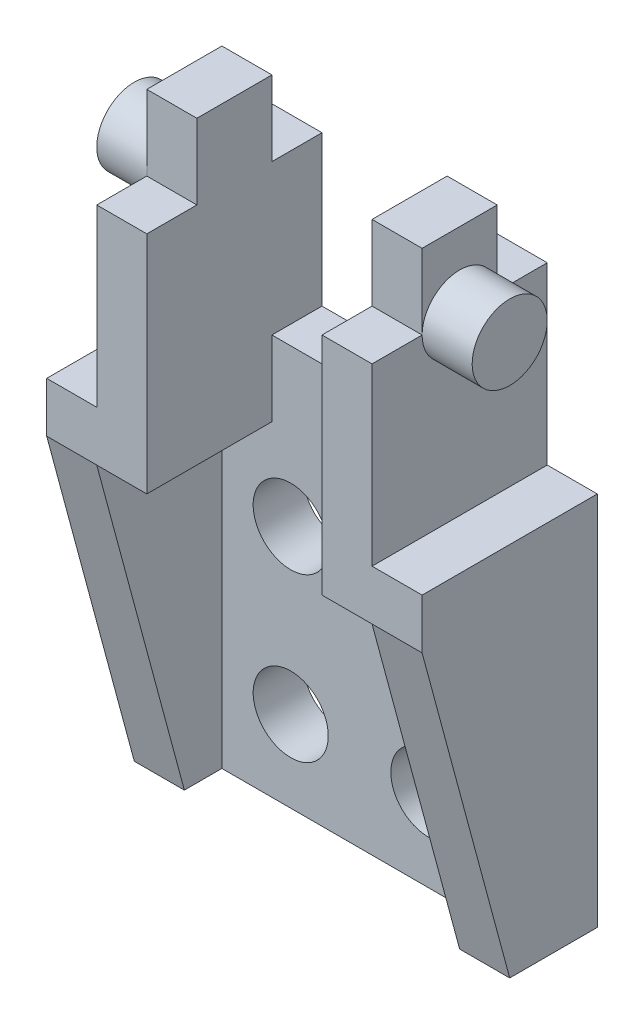
ISO-10303-21;
HEADER;
FILE_DESCRIPTION(('STEP AP214'),'2;1');
FILE_NAME('part.step','',(''),(''),'','','');
FILE_SCHEMA(('AUTOMOTIVE_DESIGN { 1 0 10303 214 1 1 1 1 }'));
ENDSEC;
DATA;
#1=APPLICATION_CONTEXT('core data for automotive mechanical design processes');
#2=APPLICATION_PROTOCOL_DEFINITION('international standard','automotive_design',2000,#1);
#3=PRODUCT_CONTEXT('',#1,'mechanical');
#4=PRODUCT('Part','Part','',(#3));
#5=PRODUCT_RELATED_PRODUCT_CATEGORY('part','',(#4));
#6=PRODUCT_DEFINITION_FORMATION('','',#4);
#7=PRODUCT_DEFINITION_CONTEXT('part definition',#1,'design');
#8=PRODUCT_DEFINITION('design','',#6,#7);
#9=PRODUCT_DEFINITION_SHAPE('','',#8);
#10=(LENGTH_UNIT() NAMED_UNIT(*) SI_UNIT(.MILLI.,.METRE.));
#11=(NAMED_UNIT(*) PLANE_ANGLE_UNIT() SI_UNIT($,.RADIAN.));
#12=(NAMED_UNIT(*) SI_UNIT($,.STERADIAN.) SOLID_ANGLE_UNIT());
#13=UNCERTAINTY_MEASURE_WITH_UNIT(LENGTH_MEASURE(1.E-05),#10,'distance_accuracy_value','');
#14=(GEOMETRIC_REPRESENTATION_CONTEXT(3) GLOBAL_UNCERTAINTY_ASSIGNED_CONTEXT((#13)) GLOBAL_UNIT_ASSIGNED_CONTEXT((#10,
#11,#12)) REPRESENTATION_CONTEXT('',''));
#15=CARTESIAN_POINT('',(0.,0.,0.));
#16=DIRECTION('',(0.,0.,1.));
#17=DIRECTION('',(1.,0.,0.));
#18=AXIS2_PLACEMENT_3D('',#15,#16,#17);
#19=CARTESIAN_POINT('',(5.5,0.,-6.));
#20=DIRECTION('',(-1.,0.,0.));
#21=DIRECTION('',(0.,-1.,0.));
#22=AXIS2_PLACEMENT_3D('',#19,#20,#21);
#23=PLANE('',#22);
#24=CARTESIAN_POINT('',(5.5,9.5,3.5));
#25=DIRECTION('',(1.,0.,0.));
#26=DIRECTION('',(0.,1.,0.));
#27=AXIS2_PLACEMENT_3D('',#24,#25,#26);
#28=CIRCLE('',#27,1.5);
#29=CARTESIAN_POINT('',(5.5,9.5,2.));
#30=VERTEX_POINT('',#29);
#31=CARTESIAN_POINT('',(5.5,9.5,5.));
#32=VERTEX_POINT('',#31);
#33=EDGE_CURVE('E436',#30,#32,#28,.T.);
#34=ORIENTED_EDGE('',*,*,#33,.F.);
#35=DIRECTION('',(0.,-1.,0.));
#36=VECTOR('',#35,1.);
#37=CARTESIAN_POINT('',(5.5,0.,2.));
#38=LINE('',#37,#36);
#39=CARTESIAN_POINT('',(5.5,12.5,2.));
#40=VERTEX_POINT('',#39);
#41=EDGE_CURVE('E271',#40,#30,#38,.T.);
#42=ORIENTED_EDGE('',*,*,#41,.F.);
#43=DIRECTION('',(0.,0.,1.));
#44=VECTOR('',#43,1.);
#45=CARTESIAN_POINT('',(5.5,12.5,-6.));
#46=LINE('',#45,#44);
#47=CARTESIAN_POINT('',(5.5,12.5,5.));
#48=VERTEX_POINT('',#47);
#49=EDGE_CURVE('E336',#40,#48,#46,.T.);
#50=ORIENTED_EDGE('',*,*,#49,.T.);
#51=DIRECTION('',(0.,-1.,0.));
#52=VECTOR('',#51,1.);
#53=CARTESIAN_POINT('',(5.5,0.,5.));
#54=LINE('',#53,#52);
#55=EDGE_CURVE('E266',#48,#32,#54,.T.);
#56=ORIENTED_EDGE('',*,*,#55,.T.);
#57=EDGE_LOOP('',(#34,#42,#50,#56));
#58=FACE_BOUND('',#57,.T.);
#59=ADVANCED_FACE('F35',(#58),#23,.F.);
#60=CARTESIAN_POINT('',(-5.5,0.,-6.));
#61=DIRECTION('',(-1.,0.,0.));
#62=DIRECTION('',(0.,-1.,0.));
#63=AXIS2_PLACEMENT_3D('',#60,#61,#62);
#64=PLANE('',#63);
#65=DIRECTION('',(0.,-1.,0.));
#66=VECTOR('',#65,1.);
#67=CARTESIAN_POINT('',(-5.5,0.,2.));
#68=LINE('',#67,#66);
#69=CARTESIAN_POINT('',(-5.5,12.5,2.));
#70=VERTEX_POINT('',#69);
#71=CARTESIAN_POINT('',(-5.5,9.5,2.));
#72=VERTEX_POINT('',#71);
#73=EDGE_CURVE('E462',#70,#72,#68,.T.);
#74=ORIENTED_EDGE('',*,*,#73,.T.);
#75=CARTESIAN_POINT('',(-5.5,9.5,3.5));
#76=DIRECTION('',(-1.,0.,0.));
#77=DIRECTION('',(0.,-1.,0.));
#78=AXIS2_PLACEMENT_3D('',#75,#76,#77);
#79=CIRCLE('',#78,1.5);
#80=CARTESIAN_POINT('',(-5.5,9.5,5.));
#81=VERTEX_POINT('',#80);
#82=EDGE_CURVE('E448',#81,#72,#79,.T.);
#83=ORIENTED_EDGE('',*,*,#82,.F.);
#84=DIRECTION('',(0.,-1.,0.));
#85=VECTOR('',#84,1.);
#86=CARTESIAN_POINT('',(-5.5,0.,5.));
#87=LINE('',#86,#85);
#88=CARTESIAN_POINT('',(-5.5,12.5,5.));
#89=VERTEX_POINT('',#88);
#90=EDGE_CURVE('E290',#89,#81,#87,.T.);
#91=ORIENTED_EDGE('',*,*,#90,.F.);
#92=DIRECTION('',(0.,0.,1.));
#93=VECTOR('',#92,1.);
#94=CARTESIAN_POINT('',(-5.5,12.5,-6.));
#95=LINE('',#94,#93);
#96=EDGE_CURVE('E353',#70,#89,#95,.T.);
#97=ORIENTED_EDGE('',*,*,#96,.F.);
#98=EDGE_LOOP('',(#74,#83,#91,#97));
#99=FACE_BOUND('',#98,.T.);
#100=ADVANCED_FACE('F501',(#99),#64,.T.);
#101=CARTESIAN_POINT('',(7.5,9.5,0.));
#102=DIRECTION('',(0.,1.,0.));
#103=DIRECTION('',(-1.,0.,0.));
#104=AXIS2_PLACEMENT_3D('',#101,#102,#103);
#105=PLANE('',#104);
#106=DIRECTION('',(0.,0.,-1.));
#107=VECTOR('',#106,1.);
#108=CARTESIAN_POINT('',(3.5,9.5,0.));
#109=LINE('',#108,#107);
#110=CARTESIAN_POINT('',(3.5,9.5,2.));
#111=VERTEX_POINT('',#110);
#112=CARTESIAN_POINT('',(3.5,9.5,0.));
#113=VERTEX_POINT('',#112);
#114=EDGE_CURVE('E11',#111,#113,#109,.T.);
#115=ORIENTED_EDGE('',*,*,#114,.F.);
#116=DIRECTION('',(-1.,0.,0.));
#117=VECTOR('',#116,1.);
#118=CARTESIAN_POINT('',(7.5,9.5,2.));
#119=LINE('',#118,#117);
#120=EDGE_CURVE('E291',#30,#111,#119,.T.);
#121=ORIENTED_EDGE('',*,*,#120,.F.);
#122=DIRECTION('',(0.,0.,-1.));
#123=VECTOR('',#122,1.);
#124=CARTESIAN_POINT('',(5.5,9.5,-6.));
#125=LINE('',#124,#123);
#126=CARTESIAN_POINT('',(5.5,9.5,0.));
#127=VERTEX_POINT('',#126);
#128=EDGE_CURVE('E269',#30,#127,#125,.T.);
#129=ORIENTED_EDGE('',*,*,#128,.T.);
#130=DIRECTION('',(-1.,0.,0.));
#131=VECTOR('',#130,1.);
#132=CARTESIAN_POINT('',(7.5,9.5,0.));
#133=LINE('',#132,#131);
#134=EDGE_CURVE('E297',#127,#113,#133,.T.);
#135=ORIENTED_EDGE('',*,*,#134,.T.);
#136=EDGE_LOOP('',(#115,#121,#129,#135));
#137=FACE_BOUND('',#136,.T.);
#138=ADVANCED_FACE('F526',(#137),#105,.T.);
#139=CARTESIAN_POINT('',(-7.5,12.5,7.));
#140=DIRECTION('',(0.,-1.,0.));
#141=DIRECTION('',(0.,0.,-1.));
#142=AXIS2_PLACEMENT_3D('',#139,#140,#141);
#143=PLANE('',#142);
#144=DIRECTION('',(-1.,0.,0.));
#145=VECTOR('',#144,1.);
#146=CARTESIAN_POINT('',(7.5,12.5,2.));
#147=LINE('',#146,#145);
#148=CARTESIAN_POINT('',(-3.5,12.5,2.));
#149=VERTEX_POINT('',#148);
#150=EDGE_CURVE('E289',#149,#70,#147,.T.);
#151=ORIENTED_EDGE('',*,*,#150,.T.);
#152=ORIENTED_EDGE('',*,*,#96,.T.);
#153=DIRECTION('',(-1.,0.,0.));
#154=VECTOR('',#153,1.);
#155=CARTESIAN_POINT('',(7.5,12.5,5.));
#156=LINE('',#155,#154);
#157=CARTESIAN_POINT('',(-3.5,12.5,5.));
#158=VERTEX_POINT('',#157);
#159=EDGE_CURVE('E313',#158,#89,#156,.T.);
#160=ORIENTED_EDGE('',*,*,#159,.F.);
#161=DIRECTION('',(0.,0.,1.));
#162=VECTOR('',#161,1.);
#163=CARTESIAN_POINT('',(-3.5,12.5,2.));
#164=LINE('',#163,#162);
#165=EDGE_CURVE('E400',#149,#158,#164,.T.);
#166=ORIENTED_EDGE('',*,*,#165,.F.);
#167=EDGE_LOOP('',(#151,#152,#160,#166));
#168=FACE_BOUND('',#167,.T.);
#169=ADVANCED_FACE('F500',(#168),#143,.F.);
#170=CARTESIAN_POINT('',(3.5,12.5,2.));
#171=VERTEX_POINT('',#170);
#172=EDGE_CURVE('E306',#40,#171,#147,.T.);
#173=ORIENTED_EDGE('',*,*,#172,.T.);
#174=DIRECTION('',(0.,0.,1.));
#175=VECTOR('',#174,1.);
#176=CARTESIAN_POINT('',(3.5,12.5,2.));
#177=LINE('',#176,#175);
#178=CARTESIAN_POINT('',(3.5,12.5,5.));
#179=VERTEX_POINT('',#178);
#180=EDGE_CURVE('E401',#171,#179,#177,.T.);
#181=ORIENTED_EDGE('',*,*,#180,.T.);
#182=EDGE_CURVE('E316',#48,#179,#156,.T.);
#183=ORIENTED_EDGE('',*,*,#182,.F.);
#184=ORIENTED_EDGE('',*,*,#49,.F.);
#185=EDGE_LOOP('',(#173,#181,#183,#184));
#186=FACE_BOUND('',#185,.T.);
#187=ADVANCED_FACE('F619',(#186),#143,.F.);
#188=CARTESIAN_POINT('',(0.,0.,0.));
#189=DIRECTION('',(0.,0.,1.));
#190=DIRECTION('',(1.,0.,0.));
#191=AXIS2_PLACEMENT_3D('',#188,#189,#190);
#192=PLANE('',#191);
#193=CARTESIAN_POINT('',(2.75,-9.25,0.));
#194=DIRECTION('',(0.,0.,1.));
#195=DIRECTION('',(1.,0.,0.));
#196=AXIS2_PLACEMENT_3D('',#193,#194,#195);
#197=CIRCLE('',#196,1.5);
#198=CARTESIAN_POINT('',(4.25,-9.25,0.));
#199=VERTEX_POINT('',#198);
#200=EDGE_CURVE('E586',#199,#199,#197,.T.);
#201=ORIENTED_EDGE('',*,*,#200,.T.);
#202=EDGE_LOOP('',(#201));
#203=FACE_BOUND('',#202,.T.);
#204=CARTESIAN_POINT('',(-2.75,-9.25000000000001,0.));
#205=DIRECTION('',(0.,0.,1.));
#206=DIRECTION('',(1.,0.,0.));
#207=AXIS2_PLACEMENT_3D('',#204,#205,#206);
#208=CIRCLE('',#207,1.5);
#209=CARTESIAN_POINT('',(-1.25,-9.25000000000001,0.));
#210=VERTEX_POINT('',#209);
#211=EDGE_CURVE('E595',#210,#210,#208,.T.);
#212=ORIENTED_EDGE('',*,*,#211,.T.);
#213=EDGE_LOOP('',(#212));
#214=FACE_BOUND('',#213,.T.);
#215=CARTESIAN_POINT('',(2.75,-2.75,0.));
#216=DIRECTION('',(0.,0.,1.));
#217=DIRECTION('',(1.,0.,0.));
#218=AXIS2_PLACEMENT_3D('',#215,#216,#217);
#219=CIRCLE('',#218,1.5);
#220=CARTESIAN_POINT('',(4.25,-2.75,0.));
#221=VERTEX_POINT('',#220);
#222=EDGE_CURVE('E601',#221,#221,#219,.T.);
#223=ORIENTED_EDGE('',*,*,#222,.T.);
#224=EDGE_LOOP('',(#223));
#225=FACE_BOUND('',#224,.T.);
#226=CARTESIAN_POINT('',(-2.75,-2.75,0.));
#227=DIRECTION('',(0.,0.,1.));
#228=DIRECTION('',(1.,0.,0.));
#229=AXIS2_PLACEMENT_3D('',#226,#227,#228);
#230=CIRCLE('',#229,1.5);
#231=CARTESIAN_POINT('',(-1.25,-2.75,0.));
#232=VERTEX_POINT('',#231);
#233=EDGE_CURVE('E607',#232,#232,#230,.T.);
#234=ORIENTED_EDGE('',*,*,#233,.T.);
#235=EDGE_LOOP('',(#234));
#236=FACE_BOUND('',#235,.T.);
#237=DIRECTION('',(1.,0.,0.));
#238=VECTOR('',#237,1.);
#239=CARTESIAN_POINT('',(0.,3.5,0.));
#240=LINE('',#239,#238);
#241=CARTESIAN_POINT('',(-3.5,3.5,0.));
#242=VERTEX_POINT('',#241);
#243=CARTESIAN_POINT('',(3.5,3.5,0.));
#244=VERTEX_POINT('',#243);
#245=EDGE_CURVE('E460',#242,#244,#240,.T.);
#246=ORIENTED_EDGE('',*,*,#245,.T.);
#247=DIRECTION('',(0.,1.,0.));
#248=VECTOR('',#247,1.);
#249=CARTESIAN_POINT('',(3.5,0.,0.));
#250=LINE('',#249,#248);
#251=EDGE_CURVE('E457',#244,#113,#250,.T.);
#252=ORIENTED_EDGE('',*,*,#251,.T.);
#253=ORIENTED_EDGE('',*,*,#134,.F.);
#254=DIRECTION('',(0.,-1.,0.));
#255=VECTOR('',#254,1.);
#256=CARTESIAN_POINT('',(5.5,0.,0.));
#257=LINE('',#256,#255);
#258=CARTESIAN_POINT('',(5.5,2.5,0.));
#259=VERTEX_POINT('',#258);
#260=EDGE_CURVE('E338',#127,#259,#257,.T.);
#261=ORIENTED_EDGE('',*,*,#260,.T.);
#262=DIRECTION('',(1.,0.,0.));
#263=VECTOR('',#262,1.);
#264=CARTESIAN_POINT('',(0.,2.5,0.));
#265=LINE('',#264,#263);
#266=CARTESIAN_POINT('',(7.5,2.5,0.));
#267=VERTEX_POINT('',#266);
#268=EDGE_CURVE('E344',#259,#267,#265,.T.);
#269=ORIENTED_EDGE('',*,*,#268,.T.);
#270=DIRECTION('',(0.,1.,0.));
#271=VECTOR('',#270,1.);
#272=CARTESIAN_POINT('',(7.5,12.5,0.));
#273=LINE('',#272,#271);
#274=CARTESIAN_POINT('',(7.5,-12.5,0.));
#275=VERTEX_POINT('',#274);
#276=EDGE_CURVE('E251',#275,#267,#273,.T.);
#277=ORIENTED_EDGE('',*,*,#276,.F.);
#278=DIRECTION('',(1.,0.,0.));
#279=VECTOR('',#278,1.);
#280=CARTESIAN_POINT('',(-7.5,-12.5,0.));
#281=LINE('',#280,#279);
#282=CARTESIAN_POINT('',(-7.5,-12.5,0.));
#283=VERTEX_POINT('',#282);
#284=EDGE_CURVE('E239',#283,#275,#281,.T.);
#285=ORIENTED_EDGE('',*,*,#284,.F.);
#286=DIRECTION('',(0.,-1.,0.));
#287=VECTOR('',#286,1.);
#288=CARTESIAN_POINT('',(-7.5,12.5,0.));
#289=LINE('',#288,#287);
#290=CARTESIAN_POINT('',(-7.5,2.5,0.));
#291=VERTEX_POINT('',#290);
#292=EDGE_CURVE('E245',#291,#283,#289,.T.);
#293=ORIENTED_EDGE('',*,*,#292,.F.);
#294=DIRECTION('',(-1.,0.,0.));
#295=VECTOR('',#294,1.);
#296=CARTESIAN_POINT('',(0.,2.5,0.));
#297=LINE('',#296,#295);
#298=CARTESIAN_POINT('',(-5.5,2.5,0.));
#299=VERTEX_POINT('',#298);
#300=EDGE_CURVE('E259',#299,#291,#297,.T.);
#301=ORIENTED_EDGE('',*,*,#300,.F.);
#302=DIRECTION('',(0.,-1.,0.));
#303=VECTOR('',#302,1.);
#304=CARTESIAN_POINT('',(-5.5,0.,0.));
#305=LINE('',#304,#303);
#306=CARTESIAN_POINT('',(-5.5,9.5,0.));
#307=VERTEX_POINT('',#306);
#308=EDGE_CURVE('E261',#307,#299,#305,.T.);
#309=ORIENTED_EDGE('',*,*,#308,.F.);
#310=CARTESIAN_POINT('',(-3.5,9.5,0.));
#311=VERTEX_POINT('',#310);
#312=EDGE_CURVE('E301',#311,#307,#133,.T.);
#313=ORIENTED_EDGE('',*,*,#312,.F.);
#314=DIRECTION('',(0.,-1.,0.));
#315=VECTOR('',#314,1.);
#316=CARTESIAN_POINT('',(-3.5,0.,0.));
#317=LINE('',#316,#315);
#318=EDGE_CURVE('E58',#311,#242,#317,.T.);
#319=ORIENTED_EDGE('',*,*,#318,.T.);
#320=EDGE_LOOP('',(#246,#252,#253,#261,#269,#277,#285,#293,#301,#309,#313,#319));
#321=FACE_BOUND('',#320,.T.);
#322=ADVANCED_FACE('F474',(#203,#214,#225,#236,#321),#192,.F.);
#323=CARTESIAN_POINT('',(0.,0.,2.));
#324=DIRECTION('',(0.,0.,1.));
#325=DIRECTION('',(1.,0.,0.));
#326=AXIS2_PLACEMENT_3D('',#323,#324,#325);
#327=PLANE('',#326);
#328=CARTESIAN_POINT('',(2.75,-9.25,2.));
#329=DIRECTION('',(0.,0.,1.));
#330=DIRECTION('',(1.,0.,0.));
#331=AXIS2_PLACEMENT_3D('',#328,#329,#330);
#332=CIRCLE('',#331,1.5);
#333=CARTESIAN_POINT('',(4.25,-9.25,2.));
#334=VERTEX_POINT('',#333);
#335=EDGE_CURVE('E589',#334,#334,#332,.T.);
#336=ORIENTED_EDGE('',*,*,#335,.F.);
#337=EDGE_LOOP('',(#336));
#338=FACE_BOUND('',#337,.T.);
#339=CARTESIAN_POINT('',(-2.75,-9.25000000000001,2.));
#340=DIRECTION('',(0.,0.,1.));
#341=DIRECTION('',(1.,0.,0.));
#342=AXIS2_PLACEMENT_3D('',#339,#340,#341);
#343=CIRCLE('',#342,1.5);
#344=CARTESIAN_POINT('',(-1.25,-9.25000000000001,2.));
#345=VERTEX_POINT('',#344);
#346=EDGE_CURVE('E592',#345,#345,#343,.T.);
#347=ORIENTED_EDGE('',*,*,#346,.F.);
#348=EDGE_LOOP('',(#347));
#349=FACE_BOUND('',#348,.T.);
#350=CARTESIAN_POINT('',(2.75,-2.75,2.));
#351=DIRECTION('',(0.,0.,1.));
#352=DIRECTION('',(1.,0.,0.));
#353=AXIS2_PLACEMENT_3D('',#350,#351,#352);
#354=CIRCLE('',#353,1.5);
#355=CARTESIAN_POINT('',(4.25,-2.75,2.));
#356=VERTEX_POINT('',#355);
#357=EDGE_CURVE('E598',#356,#356,#354,.T.);
#358=ORIENTED_EDGE('',*,*,#357,.F.);
#359=EDGE_LOOP('',(#358));
#360=FACE_BOUND('',#359,.T.);
#361=CARTESIAN_POINT('',(-2.75,-2.75,2.));
#362=DIRECTION('',(0.,0.,1.));
#363=DIRECTION('',(1.,0.,0.));
#364=AXIS2_PLACEMENT_3D('',#361,#362,#363);
#365=CIRCLE('',#364,1.5);
#366=CARTESIAN_POINT('',(-1.25,-2.75,2.));
#367=VERTEX_POINT('',#366);
#368=EDGE_CURVE('E604',#367,#367,#365,.T.);
#369=ORIENTED_EDGE('',*,*,#368,.F.);
#370=EDGE_LOOP('',(#369));
#371=FACE_BOUND('',#370,.T.);
#372=DIRECTION('',(1.,0.,0.));
#373=VECTOR('',#372,1.);
#374=CARTESIAN_POINT('',(3.5,3.5,2.));
#375=LINE('',#374,#373);
#376=CARTESIAN_POINT('',(-3.5,3.5,2.));
#377=VERTEX_POINT('',#376);
#378=CARTESIAN_POINT('',(3.5,3.5,2.));
#379=VERTEX_POINT('',#378);
#380=EDGE_CURVE('E447',#377,#379,#375,.T.);
#381=ORIENTED_EDGE('',*,*,#380,.F.);
#382=DIRECTION('',(0.,1.,0.));
#383=VECTOR('',#382,1.);
#384=CARTESIAN_POINT('',(-3.5,0.,2.));
#385=LINE('',#384,#383);
#386=CARTESIAN_POINT('',(-3.5,0.499999999999999,2.));
#387=VERTEX_POINT('',#386);
#388=EDGE_CURVE('E366',#387,#377,#385,.T.);
#389=ORIENTED_EDGE('',*,*,#388,.F.);
#390=DIRECTION('',(1.,0.,0.));
#391=VECTOR('',#390,1.);
#392=CARTESIAN_POINT('',(0.,0.499999999999999,2.));
#393=LINE('',#392,#391);
#394=CARTESIAN_POINT('',(-5.5,0.499999999999999,2.));
#395=VERTEX_POINT('',#394);
#396=EDGE_CURVE('E369',#395,#387,#393,.T.);
#397=ORIENTED_EDGE('',*,*,#396,.F.);
#398=DIRECTION('',(0.,-1.,0.));
#399=VECTOR('',#398,1.);
#400=CARTESIAN_POINT('',(-5.5,0.,2.));
#401=LINE('',#400,#399);
#402=CARTESIAN_POINT('',(-5.5,-12.5,2.));
#403=VERTEX_POINT('',#402);
#404=EDGE_CURVE('E371',#395,#403,#401,.T.);
#405=ORIENTED_EDGE('',*,*,#404,.T.);
#406=DIRECTION('',(1.,0.,0.));
#407=VECTOR('',#406,1.);
#408=CARTESIAN_POINT('',(0.,-12.5,2.));
#409=LINE('',#408,#407);
#410=CARTESIAN_POINT('',(5.5,-12.5,2.));
#411=VERTEX_POINT('',#410);
#412=EDGE_CURVE('E374',#403,#411,#409,.T.);
#413=ORIENTED_EDGE('',*,*,#412,.T.);
#414=DIRECTION('',(0.,1.,0.));
#415=VECTOR('',#414,1.);
#416=CARTESIAN_POINT('',(5.5,0.,2.));
#417=LINE('',#416,#415);
#418=CARTESIAN_POINT('',(5.5,0.499999999999999,2.));
#419=VERTEX_POINT('',#418);
#420=EDGE_CURVE('E376',#411,#419,#417,.T.);
#421=ORIENTED_EDGE('',*,*,#420,.T.);
#422=DIRECTION('',(1.,0.,0.));
#423=VECTOR('',#422,1.);
#424=CARTESIAN_POINT('',(0.,0.499999999999999,2.));
#425=LINE('',#424,#423);
#426=CARTESIAN_POINT('',(3.5,0.499999999999999,2.));
#427=VERTEX_POINT('',#426);
#428=EDGE_CURVE('E359',#427,#419,#425,.T.);
#429=ORIENTED_EDGE('',*,*,#428,.F.);
#430=DIRECTION('',(0.,-1.,0.));
#431=VECTOR('',#430,1.);
#432=CARTESIAN_POINT('',(3.5,0.,2.));
#433=LINE('',#432,#431);
#434=EDGE_CURVE('E361',#379,#427,#433,.T.);
#435=ORIENTED_EDGE('',*,*,#434,.F.);
#436=EDGE_LOOP('',(#381,#389,#397,#405,#413,#421,#429,#435));
#437=FACE_BOUND('',#436,.T.);
#438=ADVANCED_FACE('F421',(#338,#349,#360,#371,#437),#327,.T.);
#439=DIRECTION('',(0.,0.,1.));
#440=VECTOR('',#439,1.);
#441=CARTESIAN_POINT('',(-5.5,9.5,0.));
#442=LINE('',#441,#440);
#443=CARTESIAN_POINT('',(-5.5,9.5,7.));
#444=VERTEX_POINT('',#443);
#445=EDGE_CURVE('E310',#81,#444,#442,.T.);
#446=ORIENTED_EDGE('',*,*,#445,.F.);
#447=EDGE_CURVE('E440',#72,#81,#79,.T.);
#448=ORIENTED_EDGE('',*,*,#447,.F.);
#449=DIRECTION('',(0.,0.,-1.));
#450=VECTOR('',#449,1.);
#451=CARTESIAN_POINT('',(-5.5,9.5,0.));
#452=LINE('',#451,#450);
#453=EDGE_CURVE('E295',#72,#307,#452,.T.);
#454=ORIENTED_EDGE('',*,*,#453,.T.);
#455=ORIENTED_EDGE('',*,*,#308,.T.);
#456=DIRECTION('',(0.,0.,1.));
#457=VECTOR('',#456,1.);
#458=CARTESIAN_POINT('',(-5.5,2.5,-6.));
#459=LINE('',#458,#457);
#460=CARTESIAN_POINT('',(-5.5,2.5,7.));
#461=VERTEX_POINT('',#460);
#462=EDGE_CURVE('E355',#299,#461,#459,.T.);
#463=ORIENTED_EDGE('',*,*,#462,.T.);
#464=DIRECTION('',(0.,-1.,0.));
#465=VECTOR('',#464,1.);
#466=CARTESIAN_POINT('',(-5.5,0.,7.));
#467=LINE('',#466,#465);
#468=EDGE_CURVE('E350',#444,#461,#467,.T.);
#469=ORIENTED_EDGE('',*,*,#468,.F.);
#470=EDGE_LOOP('',(#446,#448,#454,#455,#463,#469));
#471=FACE_BOUND('',#470,.T.);
#472=ADVANCED_FACE('F470',(#471),#64,.T.);
#473=EDGE_CURVE('E441',#32,#30,#28,.T.);
#474=ORIENTED_EDGE('',*,*,#473,.F.);
#475=DIRECTION('',(0.,0.,1.));
#476=VECTOR('',#475,1.);
#477=CARTESIAN_POINT('',(5.5,9.5,-6.));
#478=LINE('',#477,#476);
#479=CARTESIAN_POINT('',(5.5,9.5,7.));
#480=VERTEX_POINT('',#479);
#481=EDGE_CURVE('E263',#32,#480,#478,.T.);
#482=ORIENTED_EDGE('',*,*,#481,.T.);
#483=DIRECTION('',(0.,-1.,0.));
#484=VECTOR('',#483,1.);
#485=CARTESIAN_POINT('',(5.5,0.,7.));
#486=LINE('',#485,#484);
#487=CARTESIAN_POINT('',(5.5,2.5,7.));
#488=VERTEX_POINT('',#487);
#489=EDGE_CURVE('E332',#480,#488,#486,.T.);
#490=ORIENTED_EDGE('',*,*,#489,.T.);
#491=DIRECTION('',(0.,0.,1.));
#492=VECTOR('',#491,1.);
#493=CARTESIAN_POINT('',(5.5,2.5,-6.));
#494=LINE('',#493,#492);
#495=EDGE_CURVE('E339',#259,#488,#494,.T.);
#496=ORIENTED_EDGE('',*,*,#495,.F.);
#497=ORIENTED_EDGE('',*,*,#260,.F.);
#498=ORIENTED_EDGE('',*,*,#128,.F.);
#499=EDGE_LOOP('',(#474,#482,#490,#496,#497,#498));
#500=FACE_BOUND('',#499,.T.);
#501=ADVANCED_FACE('F522',(#500),#23,.F.);
#502=CARTESIAN_POINT('',(0.,0.,7.));
#503=DIRECTION('',(0.,0.,1.));
#504=DIRECTION('',(1.,0.,0.));
#505=AXIS2_PLACEMENT_3D('',#502,#503,#504);
#506=PLANE('',#505);
#507=DIRECTION('',(-1.,0.,0.));
#508=VECTOR('',#507,1.);
#509=CARTESIAN_POINT('',(7.5,0.5,7.));
#510=LINE('',#509,#508);
#511=CARTESIAN_POINT('',(-5.5,0.499999999999999,7.));
#512=VERTEX_POINT('',#511);
#513=CARTESIAN_POINT('',(-7.5,0.499999999999999,7.));
#514=VERTEX_POINT('',#513);
#515=EDGE_CURVE('E223',#512,#514,#510,.T.);
#516=ORIENTED_EDGE('',*,*,#515,.F.);
#517=DIRECTION('',(1.,0.,0.));
#518=VECTOR('',#517,1.);
#519=CARTESIAN_POINT('',(0.,0.499999999999999,7.));
#520=LINE('',#519,#518);
#521=CARTESIAN_POINT('',(-3.5,0.499999999999999,7.));
#522=VERTEX_POINT('',#521);
#523=EDGE_CURVE('E362',#512,#522,#520,.T.);
#524=ORIENTED_EDGE('',*,*,#523,.T.);
#525=DIRECTION('',(0.,1.,0.));
#526=VECTOR('',#525,1.);
#527=CARTESIAN_POINT('',(-3.5,0.,7.));
#528=LINE('',#527,#526);
#529=CARTESIAN_POINT('',(-3.5,9.5,7.));
#530=VERTEX_POINT('',#529);
#531=EDGE_CURVE('E382',#522,#530,#528,.T.);
#532=ORIENTED_EDGE('',*,*,#531,.T.);
#533=DIRECTION('',(-1.,0.,0.));
#534=VECTOR('',#533,1.);
#535=CARTESIAN_POINT('',(7.5,9.5,7.));
#536=LINE('',#535,#534);
#537=EDGE_CURVE('E318',#530,#444,#536,.T.);
#538=ORIENTED_EDGE('',*,*,#537,.T.);
#539=ORIENTED_EDGE('',*,*,#468,.T.);
#540=DIRECTION('',(-1.,0.,0.));
#541=VECTOR('',#540,1.);
#542=CARTESIAN_POINT('',(0.,2.5,7.));
#543=LINE('',#542,#541);
#544=CARTESIAN_POINT('',(-7.5,2.5,7.));
#545=VERTEX_POINT('',#544);
#546=EDGE_CURVE('E347',#461,#545,#543,.T.);
#547=ORIENTED_EDGE('',*,*,#546,.T.);
#548=DIRECTION('',(0.,-1.,0.));
#549=VECTOR('',#548,1.);
#550=CARTESIAN_POINT('',(-7.5,12.5,7.));
#551=LINE('',#550,#549);
#552=EDGE_CURVE('E238',#545,#514,#551,.T.);
#553=ORIENTED_EDGE('',*,*,#552,.T.);
#554=EDGE_LOOP('',(#516,#524,#532,#538,#539,#547,#553));
#555=FACE_BOUND('',#554,.T.);
#556=ADVANCED_FACE('F488',(#555),#506,.T.);
#557=CARTESIAN_POINT('',(-7.5,12.5,7.));
#558=DIRECTION('',(1.,0.,0.));
#559=DIRECTION('',(0.,1.,0.));
#560=AXIS2_PLACEMENT_3D('',#557,#558,#559);
#561=PLANE('',#560);
#562=DIRECTION('',(0.,0.,-1.));
#563=VECTOR('',#562,1.);
#564=CARTESIAN_POINT('',(-7.5,-12.5,7.));
#565=LINE('',#564,#563);
#566=CARTESIAN_POINT('',(-7.5,-12.5,3.5));
#567=VERTEX_POINT('',#566);
#568=EDGE_CURVE('E257',#567,#283,#565,.T.);
#569=ORIENTED_EDGE('',*,*,#568,.F.);
#570=DIRECTION('',(0.,-0.965615758520669,-0.259973473447873));
#571=VECTOR('',#570,1.);
#572=CARTESIAN_POINT('',(-7.5,0.499999999999999,7.));
#573=LINE('',#572,#571);
#574=EDGE_CURVE('E224',#514,#567,#573,.T.);
#575=ORIENTED_EDGE('',*,*,#574,.F.);
#576=ORIENTED_EDGE('',*,*,#552,.F.);
#577=DIRECTION('',(0.,0.,1.));
#578=VECTOR('',#577,1.);
#579=CARTESIAN_POINT('',(-7.5,2.5,-6.));
#580=LINE('',#579,#578);
#581=EDGE_CURVE('E352',#291,#545,#580,.T.);
#582=ORIENTED_EDGE('',*,*,#581,.F.);
#583=ORIENTED_EDGE('',*,*,#292,.T.);
#584=EDGE_LOOP('',(#569,#575,#576,#582,#583));
#585=FACE_BOUND('',#584,.T.);
#586=ADVANCED_FACE('F484',(#585),#561,.F.);
#587=CARTESIAN_POINT('',(7.5,12.5,7.));
#588=DIRECTION('',(-1.,0.,0.));
#589=DIRECTION('',(0.,-1.,0.));
#590=AXIS2_PLACEMENT_3D('',#587,#588,#589);
#591=PLANE('',#590);
#592=DIRECTION('',(0.,1.,0.));
#593=VECTOR('',#592,1.);
#594=CARTESIAN_POINT('',(7.5,12.5,7.));
#595=LINE('',#594,#593);
#596=CARTESIAN_POINT('',(7.5,0.5,7.));
#597=VERTEX_POINT('',#596);
#598=CARTESIAN_POINT('',(7.5,2.5,7.));
#599=VERTEX_POINT('',#598);
#600=EDGE_CURVE('E230',#597,#599,#595,.T.);
#601=ORIENTED_EDGE('',*,*,#600,.F.);
#602=DIRECTION('',(0.,-0.965615758520669,-0.259973473447873));
#603=VECTOR('',#602,1.);
#604=CARTESIAN_POINT('',(7.5,0.5,7.));
#605=LINE('',#604,#603);
#606=CARTESIAN_POINT('',(7.5,-12.5,3.5));
#607=VERTEX_POINT('',#606);
#608=EDGE_CURVE('E213',#597,#607,#605,.T.);
#609=ORIENTED_EDGE('',*,*,#608,.T.);
#610=DIRECTION('',(0.,0.,-1.));
#611=VECTOR('',#610,1.);
#612=CARTESIAN_POINT('',(7.5,-12.5,7.));
#613=LINE('',#612,#611);
#614=EDGE_CURVE('E242',#607,#275,#613,.T.);
#615=ORIENTED_EDGE('',*,*,#614,.T.);
#616=ORIENTED_EDGE('',*,*,#276,.T.);
#617=DIRECTION('',(0.,0.,1.));
#618=VECTOR('',#617,1.);
#619=CARTESIAN_POINT('',(7.5,2.5,-6.));
#620=LINE('',#619,#618);
#621=EDGE_CURVE('E237',#267,#599,#620,.T.);
#622=ORIENTED_EDGE('',*,*,#621,.T.);
#623=EDGE_LOOP('',(#601,#609,#615,#616,#622));
#624=FACE_BOUND('',#623,.T.);
#625=ADVANCED_FACE('F37',(#624),#591,.F.);
#626=CARTESIAN_POINT('',(-7.5,-12.5,7.));
#627=DIRECTION('',(0.,1.,0.));
#628=DIRECTION('',(0.,0.,1.));
#629=AXIS2_PLACEMENT_3D('',#626,#627,#628);
#630=PLANE('',#629);
#631=ORIENTED_EDGE('',*,*,#614,.F.);
#632=DIRECTION('',(-1.,0.,0.));
#633=VECTOR('',#632,1.);
#634=CARTESIAN_POINT('',(7.5,-12.5,3.5));
#635=LINE('',#634,#633);
#636=CARTESIAN_POINT('',(5.5,-12.5,3.5));
#637=VERTEX_POINT('',#636);
#638=EDGE_CURVE('E219',#607,#637,#635,.T.);
#639=ORIENTED_EDGE('',*,*,#638,.T.);
#640=DIRECTION('',(0.,0.,1.));
#641=VECTOR('',#640,1.);
#642=CARTESIAN_POINT('',(5.5,-12.5,2.));
#643=LINE('',#642,#641);
#644=EDGE_CURVE('E389',#411,#637,#643,.T.);
#645=ORIENTED_EDGE('',*,*,#644,.F.);
#646=ORIENTED_EDGE('',*,*,#412,.F.);
#647=DIRECTION('',(0.,0.,1.));
#648=VECTOR('',#647,1.);
#649=CARTESIAN_POINT('',(-5.5,-12.5,2.));
#650=LINE('',#649,#648);
#651=CARTESIAN_POINT('',(-5.5,-12.5,3.5));
#652=VERTEX_POINT('',#651);
#653=EDGE_CURVE('E392',#403,#652,#650,.T.);
#654=ORIENTED_EDGE('',*,*,#653,.T.);
#655=EDGE_CURVE('E50',#652,#567,#635,.T.);
#656=ORIENTED_EDGE('',*,*,#655,.T.);
#657=ORIENTED_EDGE('',*,*,#568,.T.);
#658=ORIENTED_EDGE('',*,*,#284,.T.);
#659=EDGE_LOOP('',(#631,#639,#645,#646,#654,#656,#657,#658));
#660=FACE_BOUND('',#659,.T.);
#661=ADVANCED_FACE('F428',(#660),#630,.F.);
#662=CARTESIAN_POINT('',(5.5,0.499999999999999,7.));
#663=VERTEX_POINT('',#662);
#664=EDGE_CURVE('E216',#597,#663,#510,.T.);
#665=ORIENTED_EDGE('',*,*,#664,.F.);
#666=ORIENTED_EDGE('',*,*,#600,.T.);
#667=DIRECTION('',(1.,0.,0.));
#668=VECTOR('',#667,1.);
#669=CARTESIAN_POINT('',(0.,2.5,7.));
#670=LINE('',#669,#668);
#671=EDGE_CURVE('E334',#488,#599,#670,.T.);
#672=ORIENTED_EDGE('',*,*,#671,.F.);
#673=ORIENTED_EDGE('',*,*,#489,.F.);
#674=CARTESIAN_POINT('',(3.5,9.5,7.));
#675=VERTEX_POINT('',#674);
#676=EDGE_CURVE('E317',#480,#675,#536,.T.);
#677=ORIENTED_EDGE('',*,*,#676,.T.);
#678=DIRECTION('',(0.,-1.,0.));
#679=VECTOR('',#678,1.);
#680=CARTESIAN_POINT('',(3.5,0.,7.));
#681=LINE('',#680,#679);
#682=CARTESIAN_POINT('',(3.5,0.499999999999999,7.));
#683=VERTEX_POINT('',#682);
#684=EDGE_CURVE('E380',#675,#683,#681,.T.);
#685=ORIENTED_EDGE('',*,*,#684,.T.);
#686=DIRECTION('',(1.,0.,0.));
#687=VECTOR('',#686,1.);
#688=CARTESIAN_POINT('',(0.,0.499999999999999,7.));
#689=LINE('',#688,#687);
#690=EDGE_CURVE('E233',#683,#663,#689,.T.);
#691=ORIENTED_EDGE('',*,*,#690,.T.);
#692=EDGE_LOOP('',(#665,#666,#672,#673,#677,#685,#691));
#693=FACE_BOUND('',#692,.T.);
#694=ADVANCED_FACE('F228',(#693),#506,.T.);
#695=CARTESIAN_POINT('',(0.,0.499999999999999,2.));
#696=DIRECTION('',(0.,-1.,0.));
#697=DIRECTION('',(0.,0.,-1.));
#698=AXIS2_PLACEMENT_3D('',#695,#696,#697);
#699=PLANE('',#698);
#700=ORIENTED_EDGE('',*,*,#690,.F.);
#701=DIRECTION('',(0.,0.,1.));
#702=VECTOR('',#701,1.);
#703=CARTESIAN_POINT('',(3.5,0.499999999999999,2.));
#704=LINE('',#703,#702);
#705=EDGE_CURVE('E248',#427,#683,#704,.T.);
#706=ORIENTED_EDGE('',*,*,#705,.F.);
#707=ORIENTED_EDGE('',*,*,#428,.T.);
#708=DIRECTION('',(0.,0.,1.));
#709=VECTOR('',#708,1.);
#710=CARTESIAN_POINT('',(5.5,0.499999999999999,2.));
#711=LINE('',#710,#709);
#712=EDGE_CURVE('E253',#419,#663,#711,.T.);
#713=ORIENTED_EDGE('',*,*,#712,.T.);
#714=EDGE_LOOP('',(#700,#706,#707,#713));
#715=FACE_BOUND('',#714,.T.);
#716=ADVANCED_FACE('F417',(#715),#699,.T.);
#717=CARTESIAN_POINT('',(5.5,0.,2.));
#718=DIRECTION('',(1.,0.,0.));
#719=DIRECTION('',(0.,0.,-1.));
#720=AXIS2_PLACEMENT_3D('',#717,#718,#719);
#721=PLANE('',#720);
#722=ORIENTED_EDGE('',*,*,#644,.T.);
#723=DIRECTION('',(0.,0.96561575852067,0.259973473447873));
#724=VECTOR('',#723,1.);
#725=CARTESIAN_POINT('',(5.5,-1.22137931034483,6.53655172413793));
#726=LINE('',#725,#724);
#727=EDGE_CURVE('E431',#637,#663,#726,.T.);
#728=ORIENTED_EDGE('',*,*,#727,.T.);
#729=ORIENTED_EDGE('',*,*,#712,.F.);
#730=ORIENTED_EDGE('',*,*,#420,.F.);
#731=EDGE_LOOP('',(#722,#728,#729,#730));
#732=FACE_BOUND('',#731,.T.);
#733=ADVANCED_FACE('F426',(#732),#721,.F.);
#734=CARTESIAN_POINT('',(-5.5,0.,2.));
#735=DIRECTION('',(-1.,0.,0.));
#736=DIRECTION('',(0.,-1.,0.));
#737=AXIS2_PLACEMENT_3D('',#734,#735,#736);
#738=PLANE('',#737);
#739=DIRECTION('',(0.,0.,1.));
#740=VECTOR('',#739,1.);
#741=CARTESIAN_POINT('',(-5.5,0.499999999999999,2.));
#742=LINE('',#741,#740);
#743=EDGE_CURVE('E395',#395,#512,#742,.T.);
#744=ORIENTED_EDGE('',*,*,#743,.T.);
#745=DIRECTION('',(0.,-0.96561575852067,-0.259973473447873));
#746=VECTOR('',#745,1.);
#747=CARTESIAN_POINT('',(-5.5,-1.22137931034483,6.53655172413793));
#748=LINE('',#747,#746);
#749=EDGE_CURVE('E429',#512,#652,#748,.T.);
#750=ORIENTED_EDGE('',*,*,#749,.T.);
#751=ORIENTED_EDGE('',*,*,#653,.F.);
#752=ORIENTED_EDGE('',*,*,#404,.F.);
#753=EDGE_LOOP('',(#744,#750,#751,#752));
#754=FACE_BOUND('',#753,.T.);
#755=ADVANCED_FACE('F627',(#754),#738,.F.);
#756=CARTESIAN_POINT('',(0.,0.499999999999999,2.));
#757=DIRECTION('',(0.,-1.,0.));
#758=DIRECTION('',(0.,0.,-1.));
#759=AXIS2_PLACEMENT_3D('',#756,#757,#758);
#760=PLANE('',#759);
#761=ORIENTED_EDGE('',*,*,#523,.F.);
#762=ORIENTED_EDGE('',*,*,#743,.F.);
#763=ORIENTED_EDGE('',*,*,#396,.T.);
#764=DIRECTION('',(0.,0.,1.));
#765=VECTOR('',#764,1.);
#766=CARTESIAN_POINT('',(-3.5,0.499999999999999,2.));
#767=LINE('',#766,#765);
#768=EDGE_CURVE('E398',#387,#522,#767,.T.);
#769=ORIENTED_EDGE('',*,*,#768,.T.);
#770=EDGE_LOOP('',(#761,#762,#763,#769));
#771=FACE_BOUND('',#770,.T.);
#772=ADVANCED_FACE('F630',(#771),#760,.T.);
#773=CARTESIAN_POINT('',(-3.5,0.,2.));
#774=DIRECTION('',(1.,0.,0.));
#775=DIRECTION('',(0.,1.,0.));
#776=AXIS2_PLACEMENT_3D('',#773,#774,#775);
#777=PLANE('',#776);
#778=DIRECTION('',(0.,1.,0.));
#779=VECTOR('',#778,1.);
#780=CARTESIAN_POINT('',(-3.5,0.,5.));
#781=LINE('',#780,#779);
#782=CARTESIAN_POINT('',(-3.5,9.5,5.));
#783=VERTEX_POINT('',#782);
#784=EDGE_CURVE('E330',#783,#158,#781,.T.);
#785=ORIENTED_EDGE('',*,*,#784,.F.);
#786=DIRECTION('',(0.,0.,-1.));
#787=VECTOR('',#786,1.);
#788=CARTESIAN_POINT('',(-3.5,9.5,2.));
#789=LINE('',#788,#787);
#790=EDGE_CURVE('E326',#530,#783,#789,.T.);
#791=ORIENTED_EDGE('',*,*,#790,.F.);
#792=ORIENTED_EDGE('',*,*,#531,.F.);
#793=ORIENTED_EDGE('',*,*,#768,.F.);
#794=ORIENTED_EDGE('',*,*,#388,.T.);
#795=DIRECTION('',(0.,0.,1.));
#796=VECTOR('',#795,1.);
#797=CARTESIAN_POINT('',(-3.5,3.5,-11.));
#798=LINE('',#797,#796);
#799=EDGE_CURVE('E452',#242,#377,#798,.T.);
#800=ORIENTED_EDGE('',*,*,#799,.F.);
#801=ORIENTED_EDGE('',*,*,#318,.F.);
#802=DIRECTION('',(0.,0.,1.));
#803=VECTOR('',#802,1.);
#804=CARTESIAN_POINT('',(-3.5,9.5,0.));
#805=LINE('',#804,#803);
#806=CARTESIAN_POINT('',(-3.5,9.5,2.));
#807=VERTEX_POINT('',#806);
#808=EDGE_CURVE('E43',#311,#807,#805,.T.);
#809=ORIENTED_EDGE('',*,*,#808,.T.);
#810=DIRECTION('',(0.,1.,0.));
#811=VECTOR('',#810,1.);
#812=CARTESIAN_POINT('',(-3.5,0.,2.));
#813=LINE('',#812,#811);
#814=EDGE_CURVE('E278',#807,#149,#813,.T.);
#815=ORIENTED_EDGE('',*,*,#814,.T.);
#816=ORIENTED_EDGE('',*,*,#165,.T.);
#817=EDGE_LOOP('',(#785,#791,#792,#793,#794,#800,#801,#809,#815,#816));
#818=FACE_BOUND('',#817,.T.);
#819=ADVANCED_FACE('F276',(#818),#777,.T.);
#820=CARTESIAN_POINT('',(3.5,0.,2.));
#821=DIRECTION('',(-1.,0.,0.));
#822=DIRECTION('',(0.,-1.,0.));
#823=AXIS2_PLACEMENT_3D('',#820,#821,#822);
#824=PLANE('',#823);
#825=DIRECTION('',(0.,-1.,0.));
#826=VECTOR('',#825,1.);
#827=CARTESIAN_POINT('',(3.5,0.,5.));
#828=LINE('',#827,#826);
#829=CARTESIAN_POINT('',(3.5,9.5,5.));
#830=VERTEX_POINT('',#829);
#831=EDGE_CURVE('E328',#179,#830,#828,.T.);
#832=ORIENTED_EDGE('',*,*,#831,.F.);
#833=ORIENTED_EDGE('',*,*,#180,.F.);
#834=EDGE_CURVE('E363',#171,#111,#433,.T.);
#835=ORIENTED_EDGE('',*,*,#834,.T.);
#836=ORIENTED_EDGE('',*,*,#114,.T.);
#837=ORIENTED_EDGE('',*,*,#251,.F.);
#838=DIRECTION('',(0.,0.,1.));
#839=VECTOR('',#838,1.);
#840=CARTESIAN_POINT('',(3.5,3.5,-11.));
#841=LINE('',#840,#839);
#842=EDGE_CURVE('E453',#244,#379,#841,.T.);
#843=ORIENTED_EDGE('',*,*,#842,.T.);
#844=ORIENTED_EDGE('',*,*,#434,.T.);
#845=ORIENTED_EDGE('',*,*,#705,.T.);
#846=ORIENTED_EDGE('',*,*,#684,.F.);
#847=DIRECTION('',(0.,0.,1.));
#848=VECTOR('',#847,1.);
#849=CARTESIAN_POINT('',(3.5,9.5,2.));
#850=LINE('',#849,#848);
#851=EDGE_CURVE('E324',#830,#675,#850,.T.);
#852=ORIENTED_EDGE('',*,*,#851,.F.);
#853=EDGE_LOOP('',(#832,#833,#835,#836,#837,#843,#844,#845,#846,#852));
#854=FACE_BOUND('',#853,.T.);
#855=ADVANCED_FACE('F412',(#854),#824,.T.);
#856=CARTESIAN_POINT('',(0.,2.5,-6.));
#857=DIRECTION('',(0.,1.,0.));
#858=DIRECTION('',(0.,0.,1.));
#859=AXIS2_PLACEMENT_3D('',#856,#857,#858);
#860=PLANE('',#859);
#861=ORIENTED_EDGE('',*,*,#300,.T.);
#862=ORIENTED_EDGE('',*,*,#581,.T.);
#863=ORIENTED_EDGE('',*,*,#546,.F.);
#864=ORIENTED_EDGE('',*,*,#462,.F.);
#865=EDGE_LOOP('',(#861,#862,#863,#864));
#866=FACE_BOUND('',#865,.T.);
#867=ADVANCED_FACE('F479',(#866),#860,.T.);
#868=CARTESIAN_POINT('',(0.,2.5,-6.));
#869=DIRECTION('',(0.,-1.,0.));
#870=DIRECTION('',(0.,0.,-1.));
#871=AXIS2_PLACEMENT_3D('',#868,#869,#870);
#872=PLANE('',#871);
#873=ORIENTED_EDGE('',*,*,#495,.T.);
#874=ORIENTED_EDGE('',*,*,#671,.T.);
#875=ORIENTED_EDGE('',*,*,#621,.F.);
#876=ORIENTED_EDGE('',*,*,#268,.F.);
#877=EDGE_LOOP('',(#873,#874,#875,#876));
#878=FACE_BOUND('',#877,.T.);
#879=ADVANCED_FACE('F668',(#878),#872,.F.);
#880=CARTESIAN_POINT('',(7.5,9.5,0.));
#881=DIRECTION('',(0.,-1.,0.));
#882=DIRECTION('',(1.,0.,0.));
#883=AXIS2_PLACEMENT_3D('',#880,#881,#882);
#884=PLANE('',#883);
#885=ORIENTED_EDGE('',*,*,#851,.T.);
#886=ORIENTED_EDGE('',*,*,#676,.F.);
#887=ORIENTED_EDGE('',*,*,#481,.F.);
#888=DIRECTION('',(-1.,0.,0.));
#889=VECTOR('',#888,1.);
#890=CARTESIAN_POINT('',(7.5,9.5,5.));
#891=LINE('',#890,#889);
#892=EDGE_CURVE('E321',#32,#830,#891,.T.);
#893=ORIENTED_EDGE('',*,*,#892,.T.);
#894=EDGE_LOOP('',(#885,#886,#887,#893));
#895=FACE_BOUND('',#894,.T.);
#896=ADVANCED_FACE('F545',(#895),#884,.F.);
#897=CARTESIAN_POINT('',(7.5,0.,5.));
#898=DIRECTION('',(0.,0.,-1.));
#899=DIRECTION('',(-1.,0.,0.));
#900=AXIS2_PLACEMENT_3D('',#897,#898,#899);
#901=PLANE('',#900);
#902=ORIENTED_EDGE('',*,*,#831,.T.);
#903=ORIENTED_EDGE('',*,*,#892,.F.);
#904=ORIENTED_EDGE('',*,*,#55,.F.);
#905=ORIENTED_EDGE('',*,*,#182,.T.);
#906=EDGE_LOOP('',(#902,#903,#904,#905));
#907=FACE_BOUND('',#906,.T.);
#908=ADVANCED_FACE('F549',(#907),#901,.F.);
#909=ORIENTED_EDGE('',*,*,#784,.T.);
#910=ORIENTED_EDGE('',*,*,#159,.T.);
#911=ORIENTED_EDGE('',*,*,#90,.T.);
#912=EDGE_CURVE('E312',#783,#81,#891,.T.);
#913=ORIENTED_EDGE('',*,*,#912,.F.);
#914=EDGE_LOOP('',(#909,#910,#911,#913));
#915=FACE_BOUND('',#914,.T.);
#916=ADVANCED_FACE('F495',(#915),#901,.F.);
#917=ORIENTED_EDGE('',*,*,#790,.T.);
#918=ORIENTED_EDGE('',*,*,#912,.T.);
#919=ORIENTED_EDGE('',*,*,#445,.T.);
#920=ORIENTED_EDGE('',*,*,#537,.F.);
#921=EDGE_LOOP('',(#917,#918,#919,#920));
#922=FACE_BOUND('',#921,.T.);
#923=ADVANCED_FACE('F491',(#922),#884,.F.);
#924=CARTESIAN_POINT('',(7.5,0.,2.));
#925=DIRECTION('',(0.,0.,-1.));
#926=DIRECTION('',(-1.,0.,0.));
#927=AXIS2_PLACEMENT_3D('',#924,#925,#926);
#928=PLANE('',#927);
#929=EDGE_CURVE('E286',#807,#72,#119,.T.);
#930=ORIENTED_EDGE('',*,*,#929,.T.);
#931=ORIENTED_EDGE('',*,*,#73,.F.);
#932=ORIENTED_EDGE('',*,*,#150,.F.);
#933=ORIENTED_EDGE('',*,*,#814,.F.);
#934=EDGE_LOOP('',(#930,#931,#932,#933));
#935=FACE_BOUND('',#934,.T.);
#936=ADVANCED_FACE('F285',(#935),#928,.T.);
#937=ORIENTED_EDGE('',*,*,#172,.F.);
#938=ORIENTED_EDGE('',*,*,#41,.T.);
#939=ORIENTED_EDGE('',*,*,#120,.T.);
#940=ORIENTED_EDGE('',*,*,#834,.F.);
#941=EDGE_LOOP('',(#937,#938,#939,#940));
#942=FACE_BOUND('',#941,.T.);
#943=ADVANCED_FACE('F656',(#942),#928,.T.);
#944=ORIENTED_EDGE('',*,*,#808,.F.);
#945=ORIENTED_EDGE('',*,*,#312,.T.);
#946=ORIENTED_EDGE('',*,*,#453,.F.);
#947=ORIENTED_EDGE('',*,*,#929,.F.);
#948=EDGE_LOOP('',(#944,#945,#946,#947));
#949=FACE_BOUND('',#948,.T.);
#950=ADVANCED_FACE('F293',(#949),#105,.T.);
#951=CARTESIAN_POINT('',(3.5,3.5,-11.));
#952=DIRECTION('',(0.,-1.,0.));
#953=DIRECTION('',(1.,0.,0.));
#954=AXIS2_PLACEMENT_3D('',#951,#952,#953);
#955=PLANE('',#954);
#956=ORIENTED_EDGE('',*,*,#799,.T.);
#957=ORIENTED_EDGE('',*,*,#380,.T.);
#958=ORIENTED_EDGE('',*,*,#842,.F.);
#959=ORIENTED_EDGE('',*,*,#245,.F.);
#960=EDGE_LOOP('',(#956,#957,#958,#959));
#961=FACE_BOUND('',#960,.T.);
#962=ADVANCED_FACE('F506',(#961),#955,.F.);
#963=CARTESIAN_POINT('',(-7.5,9.5,3.5));
#964=DIRECTION('',(1.,0.,0.));
#965=DIRECTION('',(0.,1.,0.));
#966=AXIS2_PLACEMENT_3D('',#963,#964,#965);
#967=CYLINDRICAL_SURFACE('',#966,1.5);
#968=CARTESIAN_POINT('',(-7.5,9.5,3.5));
#969=DIRECTION('',(-1.,0.,0.));
#970=DIRECTION('',(0.,-1.,0.));
#971=AXIS2_PLACEMENT_3D('',#968,#969,#970);
#972=CIRCLE('',#971,1.5);
#973=CARTESIAN_POINT('',(-7.5,8.,3.5));
#974=VERTEX_POINT('',#973);
#975=EDGE_CURVE('E444',#974,#974,#972,.T.);
#976=ORIENTED_EDGE('',*,*,#975,.F.);
#977=EDGE_LOOP('',(#976));
#978=FACE_BOUND('',#977,.T.);
#979=ORIENTED_EDGE('',*,*,#82,.T.);
#980=ORIENTED_EDGE('',*,*,#447,.T.);
#981=EDGE_LOOP('',(#979,#980));
#982=FACE_BOUND('',#981,.T.);
#983=ADVANCED_FACE('F503',(#978,#982),#967,.T.);
#984=CARTESIAN_POINT('',(-7.5,0.,0.));
#985=DIRECTION('',(-1.,0.,0.));
#986=DIRECTION('',(0.,-1.,0.));
#987=AXIS2_PLACEMENT_3D('',#984,#985,#986);
#988=PLANE('',#987);
#989=ORIENTED_EDGE('',*,*,#975,.T.);
#990=EDGE_LOOP('',(#989));
#991=FACE_BOUND('',#990,.T.);
#992=ADVANCED_FACE('F505',(#991),#988,.T.);
#993=CARTESIAN_POINT('',(7.5,9.5,3.5));
#994=DIRECTION('',(-1.,0.,0.));
#995=DIRECTION('',(0.,-1.,0.));
#996=AXIS2_PLACEMENT_3D('',#993,#994,#995);
#997=CYLINDRICAL_SURFACE('',#996,1.5);
#998=CARTESIAN_POINT('',(7.5,9.5,3.5));
#999=DIRECTION('',(1.,0.,0.));
#1000=DIRECTION('',(0.,1.,0.));
#1001=AXIS2_PLACEMENT_3D('',#998,#999,#1000);
#1002=CIRCLE('',#1001,1.5);
#1003=CARTESIAN_POINT('',(7.5,11.,3.5));
#1004=VERTEX_POINT('',#1003);
#1005=EDGE_CURVE('E437',#1004,#1004,#1002,.T.);
#1006=ORIENTED_EDGE('',*,*,#1005,.F.);
#1007=EDGE_LOOP('',(#1006));
#1008=FACE_BOUND('',#1007,.T.);
#1009=ORIENTED_EDGE('',*,*,#473,.T.);
#1010=ORIENTED_EDGE('',*,*,#33,.T.);
#1011=EDGE_LOOP('',(#1009,#1010));
#1012=FACE_BOUND('',#1011,.T.);
#1013=ADVANCED_FACE('F513',(#1008,#1012),#997,.T.);
#1014=CARTESIAN_POINT('',(7.5,0.,0.));
#1015=DIRECTION('',(1.,0.,0.));
#1016=DIRECTION('',(0.,1.,0.));
#1017=AXIS2_PLACEMENT_3D('',#1014,#1015,#1016);
#1018=PLANE('',#1017);
#1019=ORIENTED_EDGE('',*,*,#1005,.T.);
#1020=EDGE_LOOP('',(#1019));
#1021=FACE_BOUND('',#1020,.T.);
#1022=ADVANCED_FACE('F553',(#1021),#1018,.T.);
#1023=CARTESIAN_POINT('',(7.5,0.5,7.));
#1024=DIRECTION('',(0.,0.259973473447873,-0.96561575852067));
#1025=DIRECTION('',(0.,0.96561575852067,0.259973473447873));
#1026=AXIS2_PLACEMENT_3D('',#1023,#1024,#1025);
#1027=PLANE('',#1026);
#1028=ORIENTED_EDGE('',*,*,#515,.T.);
#1029=ORIENTED_EDGE('',*,*,#574,.T.);
#1030=ORIENTED_EDGE('',*,*,#655,.F.);
#1031=ORIENTED_EDGE('',*,*,#749,.F.);
#1032=EDGE_LOOP('',(#1028,#1029,#1030,#1031));
#1033=FACE_BOUND('',#1032,.T.);
#1034=ADVANCED_FACE('F559',(#1033),#1027,.F.);
#1035=ORIENTED_EDGE('',*,*,#638,.F.);
#1036=ORIENTED_EDGE('',*,*,#608,.F.);
#1037=ORIENTED_EDGE('',*,*,#664,.T.);
#1038=ORIENTED_EDGE('',*,*,#727,.F.);
#1039=EDGE_LOOP('',(#1035,#1036,#1037,#1038));
#1040=FACE_BOUND('',#1039,.T.);
#1041=ADVANCED_FACE('F215',(#1040),#1027,.F.);
#1042=CARTESIAN_POINT('',(-2.75,-2.75,0.));
#1043=DIRECTION('',(0.,0.,1.));
#1044=DIRECTION('',(1.,0.,0.));
#1045=AXIS2_PLACEMENT_3D('',#1042,#1043,#1044);
#1046=CYLINDRICAL_SURFACE('',#1045,1.5);
#1047=ORIENTED_EDGE('',*,*,#233,.F.);
#1048=EDGE_LOOP('',(#1047));
#1049=FACE_BOUND('',#1048,.T.);
#1050=ORIENTED_EDGE('',*,*,#368,.T.);
#1051=EDGE_LOOP('',(#1050));
#1052=FACE_BOUND('',#1051,.T.);
#1053=ADVANCED_FACE('F566',(#1049,#1052),#1046,.F.);
#1054=CARTESIAN_POINT('',(2.75,-2.75,0.));
#1055=DIRECTION('',(0.,0.,1.));
#1056=DIRECTION('',(1.,0.,0.));
#1057=AXIS2_PLACEMENT_3D('',#1054,#1055,#1056);
#1058=CYLINDRICAL_SURFACE('',#1057,1.5);
#1059=ORIENTED_EDGE('',*,*,#222,.F.);
#1060=EDGE_LOOP('',(#1059));
#1061=FACE_BOUND('',#1060,.T.);
#1062=ORIENTED_EDGE('',*,*,#357,.T.);
#1063=EDGE_LOOP('',(#1062));
#1064=FACE_BOUND('',#1063,.T.);
#1065=ADVANCED_FACE('F569',(#1061,#1064),#1058,.F.);
#1066=CARTESIAN_POINT('',(-2.75,-9.25000000000001,0.));
#1067=DIRECTION('',(0.,0.,1.));
#1068=DIRECTION('',(1.,0.,0.));
#1069=AXIS2_PLACEMENT_3D('',#1066,#1067,#1068);
#1070=CYLINDRICAL_SURFACE('',#1069,1.5);
#1071=ORIENTED_EDGE('',*,*,#211,.F.);
#1072=EDGE_LOOP('',(#1071));
#1073=FACE_BOUND('',#1072,.T.);
#1074=ORIENTED_EDGE('',*,*,#346,.T.);
#1075=EDGE_LOOP('',(#1074));
#1076=FACE_BOUND('',#1075,.T.);
#1077=ADVANCED_FACE('F573',(#1073,#1076),#1070,.F.);
#1078=CARTESIAN_POINT('',(2.75,-9.25,0.));
#1079=DIRECTION('',(0.,0.,1.));
#1080=DIRECTION('',(1.,0.,0.));
#1081=AXIS2_PLACEMENT_3D('',#1078,#1079,#1080);
#1082=CYLINDRICAL_SURFACE('',#1081,1.5);
#1083=ORIENTED_EDGE('',*,*,#200,.F.);
#1084=EDGE_LOOP('',(#1083));
#1085=FACE_BOUND('',#1084,.T.);
#1086=ORIENTED_EDGE('',*,*,#335,.T.);
#1087=EDGE_LOOP('',(#1086));
#1088=FACE_BOUND('',#1087,.T.);
#1089=ADVANCED_FACE('F577',(#1085,#1088),#1082,.F.);
#1090=CLOSED_SHELL('',(#59,#100,#138,#169,#187,#322,#438,#472,#501,#556,#586,#625,#661,#694,
#716,#733,#755,#772,#819,#855,#867,#879,#896,#908,#916,#923,#936,#943,#950,#962,#983,#992,#1013,
#1022,#1034,#1041,#1053,#1065,#1077,#1089));
#1091=MANIFOLD_SOLID_BREP('B2',#1090);
#1092=ADVANCED_BREP_SHAPE_REPRESENTATION('',(#18,#1091),#14);
#1093=SHAPE_DEFINITION_REPRESENTATION(#9,#1092);
ENDSEC;
END-ISO-10303-21;
